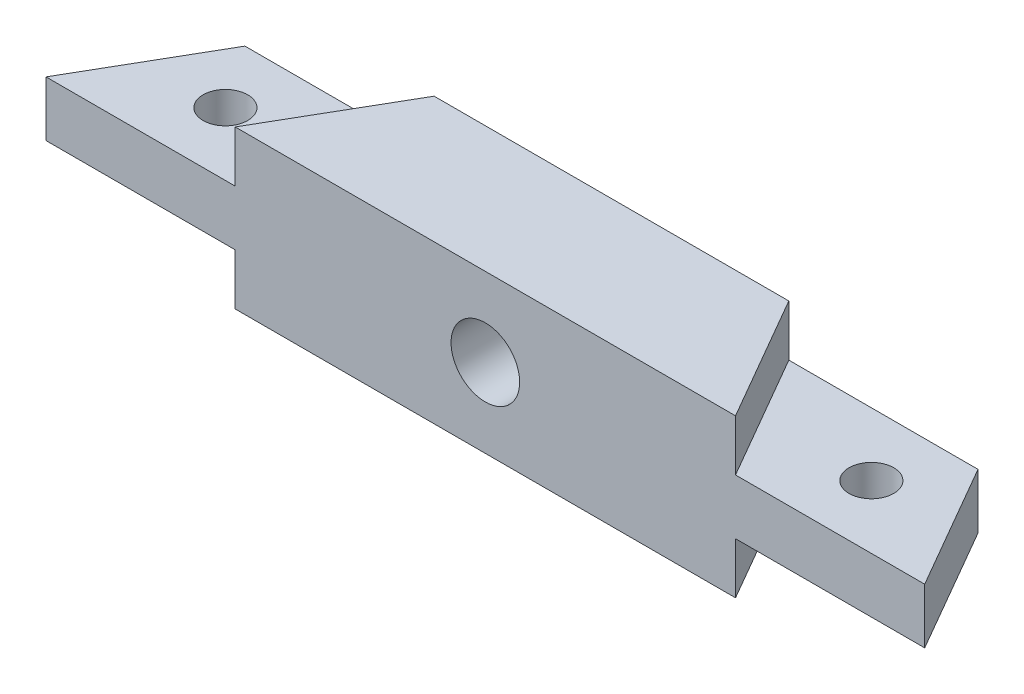
ISO-10303-21;
HEADER;
FILE_DESCRIPTION(('STEP AP214'),'2;1');
FILE_NAME('part.step','',(''),(''),'','','');
FILE_SCHEMA(('AUTOMOTIVE_DESIGN { 1 0 10303 214 1 1 1 1 }'));
ENDSEC;
DATA;
#1=APPLICATION_CONTEXT('core data for automotive mechanical design processes');
#2=APPLICATION_PROTOCOL_DEFINITION('international standard','automotive_design',2000,#1);
#3=PRODUCT_CONTEXT('',#1,'mechanical');
#4=PRODUCT('Part','Part','',(#3));
#5=PRODUCT_RELATED_PRODUCT_CATEGORY('part','',(#4));
#6=PRODUCT_DEFINITION_FORMATION('','',#4);
#7=PRODUCT_DEFINITION_CONTEXT('part definition',#1,'design');
#8=PRODUCT_DEFINITION('design','',#6,#7);
#9=PRODUCT_DEFINITION_SHAPE('','',#8);
#10=(LENGTH_UNIT() NAMED_UNIT(*) SI_UNIT(.MILLI.,.METRE.));
#11=(NAMED_UNIT(*) PLANE_ANGLE_UNIT() SI_UNIT($,.RADIAN.));
#12=(NAMED_UNIT(*) SI_UNIT($,.STERADIAN.) SOLID_ANGLE_UNIT());
#13=UNCERTAINTY_MEASURE_WITH_UNIT(LENGTH_MEASURE(1.E-05),#10,'distance_accuracy_value','');
#14=(GEOMETRIC_REPRESENTATION_CONTEXT(3) GLOBAL_UNCERTAINTY_ASSIGNED_CONTEXT((#13)) GLOBAL_UNIT_ASSIGNED_CONTEXT((#10,
#11,#12)) REPRESENTATION_CONTEXT('',''));
#15=CARTESIAN_POINT('',(0.,0.,0.));
#16=DIRECTION('',(0.,0.,1.));
#17=DIRECTION('',(1.,0.,0.));
#18=AXIS2_PLACEMENT_3D('',#15,#16,#17);
#19=CARTESIAN_POINT('',(17.859375,7.9375,-6.34999999999999));
#20=DIRECTION('',(-0.866025403784436,0.,0.500000000000004));
#21=DIRECTION('',(0.500000000000004,0.,0.866025403784436));
#22=AXIS2_PLACEMENT_3D('',#19,#20,#21);
#23=PLANE('',#22);
#24=DIRECTION('',(-0.500000000000004,0.,-0.866025403784436));
#25=VECTOR('',#24,1.);
#26=CARTESIAN_POINT('',(25.1917234187083,-2.778125,6.34999999999999));
#27=LINE('',#26,#25);
#28=CARTESIAN_POINT('',(25.1917234187083,-2.778125,6.34999999999999));
#29=VERTEX_POINT('',#28);
#30=CARTESIAN_POINT('',(17.859375,-2.778125,-6.34999999999999));
#31=VERTEX_POINT('',#30);
#32=EDGE_CURVE('E163',#29,#31,#27,.T.);
#33=ORIENTED_EDGE('',*,*,#32,.F.);
#34=DIRECTION('',(0.,-1.,0.));
#35=VECTOR('',#34,1.);
#36=CARTESIAN_POINT('',(25.1917234187083,7.9375,6.34999999999999));
#37=LINE('',#36,#35);
#38=CARTESIAN_POINT('',(25.1917234187083,-7.9375,6.34999999999999));
#39=VERTEX_POINT('',#38);
#40=EDGE_CURVE('E146',#29,#39,#37,.T.);
#41=ORIENTED_EDGE('',*,*,#40,.T.);
#42=DIRECTION('',(-0.500000000000004,0.,-0.866025403784436));
#43=VECTOR('',#42,1.);
#44=CARTESIAN_POINT('',(17.859375,-7.9375,-6.34999999999999));
#45=LINE('',#44,#43);
#46=CARTESIAN_POINT('',(17.859375,-7.9375,-6.34999999999999));
#47=VERTEX_POINT('',#46);
#48=EDGE_CURVE('E213',#39,#47,#45,.T.);
#49=ORIENTED_EDGE('',*,*,#48,.T.);
#50=DIRECTION('',(0.,-1.,0.));
#51=VECTOR('',#50,1.);
#52=CARTESIAN_POINT('',(17.859375,7.9375,-6.34999999999999));
#53=LINE('',#52,#51);
#54=EDGE_CURVE('E220',#31,#47,#53,.T.);
#55=ORIENTED_EDGE('',*,*,#54,.F.);
#56=EDGE_LOOP('',(#33,#41,#49,#55));
#57=FACE_BOUND('',#56,.T.);
#58=ADVANCED_FACE('F40',(#57),#23,.F.);
#59=CARTESIAN_POINT('',(-25.1917234187083,7.9375,6.35));
#60=DIRECTION('',(0.866025403784436,0.,0.500000000000004));
#61=DIRECTION('',(0.500000000000004,0.,-0.866025403784436));
#62=AXIS2_PLACEMENT_3D('',#59,#60,#61);
#63=PLANE('',#62);
#64=DIRECTION('',(-0.500000000000004,0.,0.866025403784436));
#65=VECTOR('',#64,1.);
#66=CARTESIAN_POINT('',(-17.859375,-2.778125,-6.34999999999999));
#67=LINE('',#66,#65);
#68=CARTESIAN_POINT('',(-17.859375,-2.778125,-6.34999999999999));
#69=VERTEX_POINT('',#68);
#70=CARTESIAN_POINT('',(-25.1917234187083,-2.778125,6.35));
#71=VERTEX_POINT('',#70);
#72=EDGE_CURVE('E63',#69,#71,#67,.T.);
#73=ORIENTED_EDGE('',*,*,#72,.F.);
#74=DIRECTION('',(0.,-1.,0.));
#75=VECTOR('',#74,1.);
#76=CARTESIAN_POINT('',(-17.859375,7.9375,-6.34999999999999));
#77=LINE('',#76,#75);
#78=CARTESIAN_POINT('',(-17.859375,-7.9375,-6.34999999999999));
#79=VERTEX_POINT('',#78);
#80=EDGE_CURVE('E208',#69,#79,#77,.T.);
#81=ORIENTED_EDGE('',*,*,#80,.T.);
#82=DIRECTION('',(-0.500000000000004,0.,0.866025403784436));
#83=VECTOR('',#82,1.);
#84=CARTESIAN_POINT('',(-25.1917234187083,-7.9375,6.35));
#85=LINE('',#84,#83);
#86=CARTESIAN_POINT('',(-25.1917234187083,-7.9375,6.35));
#87=VERTEX_POINT('',#86);
#88=EDGE_CURVE('E195',#79,#87,#85,.T.);
#89=ORIENTED_EDGE('',*,*,#88,.T.);
#90=DIRECTION('',(0.,-1.,0.));
#91=VECTOR('',#90,1.);
#92=CARTESIAN_POINT('',(-25.1917234187083,7.9375,6.35));
#93=LINE('',#92,#91);
#94=EDGE_CURVE('E48',#71,#87,#93,.T.);
#95=ORIENTED_EDGE('',*,*,#94,.F.);
#96=EDGE_LOOP('',(#73,#81,#89,#95));
#97=FACE_BOUND('',#96,.T.);
#98=ADVANCED_FACE('F277',(#97),#63,.F.);
#99=CARTESIAN_POINT('',(-17.859375,7.9375,-6.34999999999999));
#100=VERTEX_POINT('',#99);
#101=CARTESIAN_POINT('',(-17.859375,2.778125,-6.34999999999999));
#102=VERTEX_POINT('',#101);
#103=EDGE_CURVE('E218',#100,#102,#77,.T.);
#104=ORIENTED_EDGE('',*,*,#103,.T.);
#105=DIRECTION('',(-0.500000000000004,0.,0.866025403784436));
#106=VECTOR('',#105,1.);
#107=CARTESIAN_POINT('',(-17.859375,2.778125,-6.34999999999999));
#108=LINE('',#107,#106);
#109=CARTESIAN_POINT('',(-25.1917234187083,2.778125,6.35));
#110=VERTEX_POINT('',#109);
#111=EDGE_CURVE('E167',#102,#110,#108,.T.);
#112=ORIENTED_EDGE('',*,*,#111,.T.);
#113=CARTESIAN_POINT('',(-25.1917234187083,7.9375,6.35));
#114=VERTEX_POINT('',#113);
#115=EDGE_CURVE('E11',#114,#110,#93,.T.);
#116=ORIENTED_EDGE('',*,*,#115,.F.);
#117=DIRECTION('',(-0.500000000000004,0.,0.866025403784436));
#118=VECTOR('',#117,1.);
#119=CARTESIAN_POINT('',(-25.1917234187083,7.9375,6.35));
#120=LINE('',#119,#118);
#121=EDGE_CURVE('E198',#100,#114,#120,.T.);
#122=ORIENTED_EDGE('',*,*,#121,.F.);
#123=EDGE_LOOP('',(#104,#112,#116,#122));
#124=FACE_BOUND('',#123,.T.);
#125=ADVANCED_FACE('F42',(#124),#63,.F.);
#126=CARTESIAN_POINT('',(25.1917234187083,7.9375,6.34999999999999));
#127=DIRECTION('',(0.,0.,-1.));
#128=DIRECTION('',(-1.,0.,0.));
#129=AXIS2_PLACEMENT_3D('',#126,#127,#128);
#130=PLANE('',#129);
#131=CARTESIAN_POINT('',(0.,0.,6.34999999999999));
#132=DIRECTION('',(0.,0.,1.));
#133=DIRECTION('',(1.,0.,0.));
#134=AXIS2_PLACEMENT_3D('',#131,#132,#133);
#135=CIRCLE('',#134,3.4544);
#136=CARTESIAN_POINT('',(3.4544,0.,6.34999999999999));
#137=VERTEX_POINT('',#136);
#138=EDGE_CURVE('E191',#137,#137,#135,.T.);
#139=ORIENTED_EDGE('',*,*,#138,.F.);
#140=EDGE_LOOP('',(#139));
#141=FACE_BOUND('',#140,.T.);
#142=DIRECTION('',(1.,0.,0.));
#143=VECTOR('',#142,1.);
#144=CARTESIAN_POINT('',(25.1917234187083,-7.9375,6.34999999999999));
#145=LINE('',#144,#143);
#146=EDGE_CURVE('E211',#87,#39,#145,.T.);
#147=ORIENTED_EDGE('',*,*,#146,.T.);
#148=ORIENTED_EDGE('',*,*,#40,.F.);
#149=DIRECTION('',(1.,0.,0.));
#150=VECTOR('',#149,1.);
#151=CARTESIAN_POINT('',(25.1917234187083,-2.778125,6.34999999999999));
#152=LINE('',#151,#150);
#153=CARTESIAN_POINT('',(44.2417234187083,-2.778125,6.34999999999999));
#154=VERTEX_POINT('',#153);
#155=EDGE_CURVE('E143',#29,#154,#152,.T.);
#156=ORIENTED_EDGE('',*,*,#155,.T.);
#157=DIRECTION('',(0.,1.,0.));
#158=VECTOR('',#157,1.);
#159=CARTESIAN_POINT('',(44.2417234187083,-2.778125,6.34999999999999));
#160=LINE('',#159,#158);
#161=CARTESIAN_POINT('',(44.2417234187083,2.778125,6.34999999999999));
#162=VERTEX_POINT('',#161);
#163=EDGE_CURVE('E132',#154,#162,#160,.T.);
#164=ORIENTED_EDGE('',*,*,#163,.T.);
#165=DIRECTION('',(-1.,0.,0.));
#166=VECTOR('',#165,1.);
#167=CARTESIAN_POINT('',(25.1917234187083,2.778125,6.34999999999999));
#168=LINE('',#167,#166);
#169=CARTESIAN_POINT('',(25.1917234187083,2.778125,6.34999999999999));
#170=VERTEX_POINT('',#169);
#171=EDGE_CURVE('E139',#162,#170,#168,.T.);
#172=ORIENTED_EDGE('',*,*,#171,.T.);
#173=CARTESIAN_POINT('',(25.1917234187083,7.9375,6.34999999999999));
#174=VERTEX_POINT('',#173);
#175=EDGE_CURVE('E223',#174,#170,#37,.T.);
#176=ORIENTED_EDGE('',*,*,#175,.F.);
#177=DIRECTION('',(1.,0.,0.));
#178=VECTOR('',#177,1.);
#179=CARTESIAN_POINT('',(25.1917234187083,7.9375,6.34999999999999));
#180=LINE('',#179,#178);
#181=EDGE_CURVE('E201',#114,#174,#180,.T.);
#182=ORIENTED_EDGE('',*,*,#181,.F.);
#183=ORIENTED_EDGE('',*,*,#115,.T.);
#184=DIRECTION('',(-1.,0.,0.));
#185=VECTOR('',#184,1.);
#186=CARTESIAN_POINT('',(-25.1917234187083,2.778125,6.34999999999999));
#187=LINE('',#186,#185);
#188=CARTESIAN_POINT('',(-44.2417234187083,2.778125,6.35));
#189=VERTEX_POINT('',#188);
#190=EDGE_CURVE('E169',#110,#189,#187,.T.);
#191=ORIENTED_EDGE('',*,*,#190,.T.);
#192=DIRECTION('',(0.,-1.,0.));
#193=VECTOR('',#192,1.);
#194=CARTESIAN_POINT('',(-44.2417234187083,-2.778125,6.34999999999999));
#195=LINE('',#194,#193);
#196=CARTESIAN_POINT('',(-44.2417234187083,-2.778125,6.35));
#197=VERTEX_POINT('',#196);
#198=EDGE_CURVE('E179',#189,#197,#195,.T.);
#199=ORIENTED_EDGE('',*,*,#198,.T.);
#200=DIRECTION('',(1.,0.,0.));
#201=VECTOR('',#200,1.);
#202=CARTESIAN_POINT('',(-25.1917234187083,-2.778125,6.34999999999999));
#203=LINE('',#202,#201);
#204=EDGE_CURVE('E186',#197,#71,#203,.T.);
#205=ORIENTED_EDGE('',*,*,#204,.T.);
#206=ORIENTED_EDGE('',*,*,#94,.T.);
#207=EDGE_LOOP('',(#147,#148,#156,#164,#172,#176,#182,#183,#191,#199,#205,#206));
#208=FACE_BOUND('',#207,.T.);
#209=ADVANCED_FACE('F145',(#141,#208),#130,.F.);
#210=ORIENTED_EDGE('',*,*,#175,.T.);
#211=DIRECTION('',(-0.500000000000004,0.,-0.866025403784436));
#212=VECTOR('',#211,1.);
#213=CARTESIAN_POINT('',(25.1917234187083,2.778125,6.34999999999999));
#214=LINE('',#213,#212);
#215=CARTESIAN_POINT('',(17.859375,2.778125,-6.34999999999999));
#216=VERTEX_POINT('',#215);
#217=EDGE_CURVE('E161',#170,#216,#214,.T.);
#218=ORIENTED_EDGE('',*,*,#217,.T.);
#219=CARTESIAN_POINT('',(17.859375,7.9375,-6.34999999999999));
#220=VERTEX_POINT('',#219);
#221=EDGE_CURVE('E221',#220,#216,#53,.T.);
#222=ORIENTED_EDGE('',*,*,#221,.F.);
#223=DIRECTION('',(-0.500000000000004,0.,-0.866025403784436));
#224=VECTOR('',#223,1.);
#225=CARTESIAN_POINT('',(17.859375,7.9375,-6.34999999999999));
#226=LINE('',#225,#224);
#227=EDGE_CURVE('E204',#174,#220,#226,.T.);
#228=ORIENTED_EDGE('',*,*,#227,.F.);
#229=EDGE_LOOP('',(#210,#218,#222,#228));
#230=FACE_BOUND('',#229,.T.);
#231=ADVANCED_FACE('F241',(#230),#23,.F.);
#232=CARTESIAN_POINT('',(-17.859375,7.9375,-6.34999999999999));
#233=DIRECTION('',(0.,0.,1.));
#234=DIRECTION('',(1.,0.,0.));
#235=AXIS2_PLACEMENT_3D('',#232,#233,#234);
#236=PLANE('',#235);
#237=CARTESIAN_POINT('',(0.,0.,-6.34999999999999));
#238=DIRECTION('',(0.,0.,1.));
#239=DIRECTION('',(1.,0.,0.));
#240=AXIS2_PLACEMENT_3D('',#237,#238,#239);
#241=CIRCLE('',#240,3.4544);
#242=CARTESIAN_POINT('',(3.4544,0.,-6.34999999999999));
#243=VERTEX_POINT('',#242);
#244=EDGE_CURVE('E192',#243,#243,#241,.T.);
#245=ORIENTED_EDGE('',*,*,#244,.T.);
#246=EDGE_LOOP('',(#245));
#247=FACE_BOUND('',#246,.T.);
#248=DIRECTION('',(-1.,0.,0.));
#249=VECTOR('',#248,1.);
#250=CARTESIAN_POINT('',(-17.859375,-7.9375,-6.34999999999999));
#251=LINE('',#250,#249);
#252=EDGE_CURVE('E202',#47,#79,#251,.T.);
#253=ORIENTED_EDGE('',*,*,#252,.T.);
#254=ORIENTED_EDGE('',*,*,#80,.F.);
#255=DIRECTION('',(1.,0.,0.));
#256=VECTOR('',#255,1.);
#257=CARTESIAN_POINT('',(-17.859375,-2.778125,-6.34999999999999));
#258=LINE('',#257,#256);
#259=CARTESIAN_POINT('',(-36.909375,-2.778125,-6.34999999999999));
#260=VERTEX_POINT('',#259);
#261=EDGE_CURVE('E171',#260,#69,#258,.T.);
#262=ORIENTED_EDGE('',*,*,#261,.F.);
#263=DIRECTION('',(0.,-1.,0.));
#264=VECTOR('',#263,1.);
#265=CARTESIAN_POINT('',(-36.909375,-2.778125,-6.34999999999999));
#266=LINE('',#265,#264);
#267=CARTESIAN_POINT('',(-36.909375,2.778125,-6.34999999999999));
#268=VERTEX_POINT('',#267);
#269=EDGE_CURVE('E174',#268,#260,#266,.T.);
#270=ORIENTED_EDGE('',*,*,#269,.F.);
#271=DIRECTION('',(-1.,0.,0.));
#272=VECTOR('',#271,1.);
#273=CARTESIAN_POINT('',(-17.859375,2.778125,-6.34999999999999));
#274=LINE('',#273,#272);
#275=EDGE_CURVE('E166',#102,#268,#274,.T.);
#276=ORIENTED_EDGE('',*,*,#275,.F.);
#277=ORIENTED_EDGE('',*,*,#103,.F.);
#278=DIRECTION('',(-1.,0.,0.));
#279=VECTOR('',#278,1.);
#280=CARTESIAN_POINT('',(-17.859375,7.9375,-6.34999999999999));
#281=LINE('',#280,#279);
#282=EDGE_CURVE('E206',#220,#100,#281,.T.);
#283=ORIENTED_EDGE('',*,*,#282,.F.);
#284=ORIENTED_EDGE('',*,*,#221,.T.);
#285=DIRECTION('',(-1.,0.,0.));
#286=VECTOR('',#285,1.);
#287=CARTESIAN_POINT('',(17.859375,2.778125,-6.34999999999999));
#288=LINE('',#287,#286);
#289=CARTESIAN_POINT('',(36.909375,2.778125,-6.34999999999999));
#290=VERTEX_POINT('',#289);
#291=EDGE_CURVE('E55',#290,#216,#288,.T.);
#292=ORIENTED_EDGE('',*,*,#291,.F.);
#293=DIRECTION('',(0.,1.,0.));
#294=VECTOR('',#293,1.);
#295=CARTESIAN_POINT('',(36.909375,-2.778125,-6.34999999999999));
#296=LINE('',#295,#294);
#297=CARTESIAN_POINT('',(36.909375,-2.778125,-6.34999999999999));
#298=VERTEX_POINT('',#297);
#299=EDGE_CURVE('E154',#298,#290,#296,.T.);
#300=ORIENTED_EDGE('',*,*,#299,.F.);
#301=DIRECTION('',(1.,0.,0.));
#302=VECTOR('',#301,1.);
#303=CARTESIAN_POINT('',(17.859375,-2.778125,-6.34999999999999));
#304=LINE('',#303,#302);
#305=EDGE_CURVE('E152',#31,#298,#304,.T.);
#306=ORIENTED_EDGE('',*,*,#305,.F.);
#307=ORIENTED_EDGE('',*,*,#54,.T.);
#308=EDGE_LOOP('',(#253,#254,#262,#270,#276,#277,#283,#284,#292,#300,#306,#307));
#309=FACE_BOUND('',#308,.T.);
#310=ADVANCED_FACE('F237',(#247,#309),#236,.F.);
#311=CARTESIAN_POINT('',(0.,7.9375,0.));
#312=DIRECTION('',(0.,-1.,0.));
#313=DIRECTION('',(0.,0.,-1.));
#314=AXIS2_PLACEMENT_3D('',#311,#312,#313);
#315=PLANE('',#314);
#316=ORIENTED_EDGE('',*,*,#121,.T.);
#317=ORIENTED_EDGE('',*,*,#181,.T.);
#318=ORIENTED_EDGE('',*,*,#227,.T.);
#319=ORIENTED_EDGE('',*,*,#282,.T.);
#320=EDGE_LOOP('',(#316,#317,#318,#319));
#321=FACE_BOUND('',#320,.T.);
#322=ADVANCED_FACE('F243',(#321),#315,.F.);
#323=CARTESIAN_POINT('',(0.,-7.9375,0.));
#324=DIRECTION('',(0.,-1.,0.));
#325=DIRECTION('',(0.,0.,-1.));
#326=AXIS2_PLACEMENT_3D('',#323,#324,#325);
#327=PLANE('',#326);
#328=ORIENTED_EDGE('',*,*,#88,.F.);
#329=ORIENTED_EDGE('',*,*,#252,.F.);
#330=ORIENTED_EDGE('',*,*,#48,.F.);
#331=ORIENTED_EDGE('',*,*,#146,.F.);
#332=EDGE_LOOP('',(#328,#329,#330,#331));
#333=FACE_BOUND('',#332,.T.);
#334=ADVANCED_FACE('F235',(#333),#327,.T.);
#335=CARTESIAN_POINT('',(0.,0.,-6.34999999999999));
#336=DIRECTION('',(0.,0.,1.));
#337=DIRECTION('',(1.,0.,0.));
#338=AXIS2_PLACEMENT_3D('',#335,#336,#337);
#339=CYLINDRICAL_SURFACE('',#338,3.4544);
#340=ORIENTED_EDGE('',*,*,#244,.F.);
#341=EDGE_LOOP('',(#340));
#342=FACE_BOUND('',#341,.T.);
#343=ORIENTED_EDGE('',*,*,#138,.T.);
#344=EDGE_LOOP('',(#343));
#345=FACE_BOUND('',#344,.T.);
#346=ADVANCED_FACE('F264',(#342,#345),#339,.F.);
#347=CARTESIAN_POINT('',(-17.859375,2.778125,-6.34999999999999));
#348=DIRECTION('',(0.,1.,0.));
#349=DIRECTION('',(-1.,0.,0.));
#350=AXIS2_PLACEMENT_3D('',#347,#348,#349);
#351=PLANE('',#350);
#352=CARTESIAN_POINT('',(-32.5240718374165,2.778125,0.));
#353=DIRECTION('',(0.,1.,0.));
#354=DIRECTION('',(-1.,0.,0.));
#355=AXIS2_PLACEMENT_3D('',#352,#353,#354);
#356=CIRCLE('',#355,2.2479);
#357=CARTESIAN_POINT('',(-34.7719718374165,2.778125,0.));
#358=VERTEX_POINT('',#357);
#359=EDGE_CURVE('E140',#358,#358,#356,.T.);
#360=ORIENTED_EDGE('',*,*,#359,.F.);
#361=EDGE_LOOP('',(#360));
#362=FACE_BOUND('',#361,.T.);
#363=DIRECTION('',(-0.500000000000004,0.,0.866025403784436));
#364=VECTOR('',#363,1.);
#365=CARTESIAN_POINT('',(-36.909375,2.778125,-6.34999999999999));
#366=LINE('',#365,#364);
#367=EDGE_CURVE('E176',#268,#189,#366,.T.);
#368=ORIENTED_EDGE('',*,*,#367,.T.);
#369=ORIENTED_EDGE('',*,*,#190,.F.);
#370=ORIENTED_EDGE('',*,*,#111,.F.);
#371=ORIENTED_EDGE('',*,*,#275,.T.);
#372=EDGE_LOOP('',(#368,#369,#370,#371));
#373=FACE_BOUND('',#372,.T.);
#374=ADVANCED_FACE('F252',(#362,#373),#351,.T.);
#375=CARTESIAN_POINT('',(-36.909375,-2.778125,-6.34999999999999));
#376=DIRECTION('',(-0.866025403784436,0.,-0.500000000000004));
#377=DIRECTION('',(-0.500000000000004,0.,0.866025403784436));
#378=AXIS2_PLACEMENT_3D('',#375,#376,#377);
#379=PLANE('',#378);
#380=DIRECTION('',(-0.500000000000004,0.,0.866025403784436));
#381=VECTOR('',#380,1.);
#382=CARTESIAN_POINT('',(-36.909375,-2.778125,-6.34999999999999));
#383=LINE('',#382,#381);
#384=EDGE_CURVE('E183',#260,#197,#383,.T.);
#385=ORIENTED_EDGE('',*,*,#384,.T.);
#386=ORIENTED_EDGE('',*,*,#198,.F.);
#387=ORIENTED_EDGE('',*,*,#367,.F.);
#388=ORIENTED_EDGE('',*,*,#269,.T.);
#389=EDGE_LOOP('',(#385,#386,#387,#388));
#390=FACE_BOUND('',#389,.T.);
#391=ADVANCED_FACE('F256',(#390),#379,.T.);
#392=CARTESIAN_POINT('',(-17.859375,-2.778125,-6.34999999999999));
#393=DIRECTION('',(0.,-1.,0.));
#394=DIRECTION('',(1.,0.,0.));
#395=AXIS2_PLACEMENT_3D('',#392,#393,#394);
#396=PLANE('',#395);
#397=CARTESIAN_POINT('',(-32.5240718374165,-2.778125,0.));
#398=DIRECTION('',(0.,-1.,0.));
#399=DIRECTION('',(1.,0.,0.));
#400=AXIS2_PLACEMENT_3D('',#397,#398,#399);
#401=CIRCLE('',#400,2.2479);
#402=CARTESIAN_POINT('',(-30.2761718374165,-2.778125,0.));
#403=VERTEX_POINT('',#402);
#404=EDGE_CURVE('E440',#403,#403,#401,.F.);
#405=ORIENTED_EDGE('',*,*,#404,.T.);
#406=EDGE_LOOP('',(#405));
#407=FACE_BOUND('',#406,.T.);
#408=ORIENTED_EDGE('',*,*,#204,.F.);
#409=ORIENTED_EDGE('',*,*,#384,.F.);
#410=ORIENTED_EDGE('',*,*,#261,.T.);
#411=ORIENTED_EDGE('',*,*,#72,.T.);
#412=EDGE_LOOP('',(#408,#409,#410,#411));
#413=FACE_BOUND('',#412,.T.);
#414=ADVANCED_FACE('F260',(#407,#413),#396,.T.);
#415=CARTESIAN_POINT('',(44.2417234187083,-2.778125,6.34999999999999));
#416=DIRECTION('',(-0.866025403784436,0.,0.500000000000004));
#417=DIRECTION('',(0.500000000000004,0.,0.866025403784436));
#418=AXIS2_PLACEMENT_3D('',#415,#416,#417);
#419=PLANE('',#418);
#420=DIRECTION('',(-0.500000000000004,0.,-0.866025403784436));
#421=VECTOR('',#420,1.);
#422=CARTESIAN_POINT('',(44.2417234187083,2.778125,6.34999999999999));
#423=LINE('',#422,#421);
#424=EDGE_CURVE('E137',#162,#290,#423,.T.);
#425=ORIENTED_EDGE('',*,*,#424,.F.);
#426=ORIENTED_EDGE('',*,*,#163,.F.);
#427=DIRECTION('',(-0.500000000000004,0.,-0.866025403784436));
#428=VECTOR('',#427,1.);
#429=CARTESIAN_POINT('',(44.2417234187083,-2.778125,6.34999999999999));
#430=LINE('',#429,#428);
#431=EDGE_CURVE('E136',#154,#298,#430,.T.);
#432=ORIENTED_EDGE('',*,*,#431,.T.);
#433=ORIENTED_EDGE('',*,*,#299,.T.);
#434=EDGE_LOOP('',(#425,#426,#432,#433));
#435=FACE_BOUND('',#434,.T.);
#436=ADVANCED_FACE('F134',(#435),#419,.F.);
#437=CARTESIAN_POINT('',(25.1917234187083,2.778125,6.34999999999999));
#438=DIRECTION('',(0.,-1.,0.));
#439=DIRECTION('',(1.,0.,0.));
#440=AXIS2_PLACEMENT_3D('',#437,#438,#439);
#441=PLANE('',#440);
#442=CARTESIAN_POINT('',(32.5240718374165,2.778125,0.));
#443=DIRECTION('',(0.,1.,0.));
#444=DIRECTION('',(1.,0.,0.));
#445=AXIS2_PLACEMENT_3D('',#442,#443,#444);
#446=CIRCLE('',#445,2.2479);
#447=CARTESIAN_POINT('',(34.7719718374165,2.778125,0.));
#448=VERTEX_POINT('',#447);
#449=EDGE_CURVE('E447',#448,#448,#446,.T.);
#450=ORIENTED_EDGE('',*,*,#449,.F.);
#451=EDGE_LOOP('',(#450));
#452=FACE_BOUND('',#451,.T.);
#453=ORIENTED_EDGE('',*,*,#217,.F.);
#454=ORIENTED_EDGE('',*,*,#171,.F.);
#455=ORIENTED_EDGE('',*,*,#424,.T.);
#456=ORIENTED_EDGE('',*,*,#291,.T.);
#457=EDGE_LOOP('',(#453,#454,#455,#456));
#458=FACE_BOUND('',#457,.T.);
#459=ADVANCED_FACE('F240',(#452,#458),#441,.F.);
#460=CARTESIAN_POINT('',(25.1917234187083,-2.778125,6.34999999999999));
#461=DIRECTION('',(0.,1.,0.));
#462=DIRECTION('',(-1.,0.,0.));
#463=AXIS2_PLACEMENT_3D('',#460,#461,#462);
#464=PLANE('',#463);
#465=CARTESIAN_POINT('',(32.5240718374165,-2.778125,0.));
#466=DIRECTION('',(0.,1.,0.));
#467=DIRECTION('',(-1.,0.,0.));
#468=AXIS2_PLACEMENT_3D('',#465,#466,#467);
#469=CIRCLE('',#468,2.2479);
#470=CARTESIAN_POINT('',(30.2761718374165,-2.778125,0.));
#471=VERTEX_POINT('',#470);
#472=EDGE_CURVE('E444',#471,#471,#469,.F.);
#473=ORIENTED_EDGE('',*,*,#472,.F.);
#474=EDGE_LOOP('',(#473));
#475=FACE_BOUND('',#474,.T.);
#476=ORIENTED_EDGE('',*,*,#305,.T.);
#477=ORIENTED_EDGE('',*,*,#431,.F.);
#478=ORIENTED_EDGE('',*,*,#155,.F.);
#479=ORIENTED_EDGE('',*,*,#32,.T.);
#480=EDGE_LOOP('',(#476,#477,#478,#479));
#481=FACE_BOUND('',#480,.T.);
#482=ADVANCED_FACE('F151',(#475,#481),#464,.F.);
#483=CARTESIAN_POINT('',(32.5240718374165,-7.9385,0.));
#484=DIRECTION('',(0.,1.,0.));
#485=DIRECTION('',(-1.,0.,0.));
#486=AXIS2_PLACEMENT_3D('',#483,#484,#485);
#487=CYLINDRICAL_SURFACE('',#486,2.2479);
#488=ORIENTED_EDGE('',*,*,#449,.T.);
#489=EDGE_LOOP('',(#488));
#490=FACE_BOUND('',#489,.T.);
#491=ORIENTED_EDGE('',*,*,#472,.T.);
#492=EDGE_LOOP('',(#491));
#493=FACE_BOUND('',#492,.T.);
#494=ADVANCED_FACE('F270',(#490,#493),#487,.F.);
#495=CARTESIAN_POINT('',(-32.5240718374165,-7.9385,0.));
#496=DIRECTION('',(0.,1.,0.));
#497=DIRECTION('',(-1.,0.,0.));
#498=AXIS2_PLACEMENT_3D('',#495,#496,#497);
#499=CYLINDRICAL_SURFACE('',#498,2.2479);
#500=ORIENTED_EDGE('',*,*,#404,.F.);
#501=EDGE_LOOP('',(#500));
#502=FACE_BOUND('',#501,.T.);
#503=ORIENTED_EDGE('',*,*,#359,.T.);
#504=EDGE_LOOP('',(#503));
#505=FACE_BOUND('',#504,.T.);
#506=ADVANCED_FACE('F365',(#502,#505),#499,.F.);
#507=CLOSED_SHELL('',(#58,#98,#125,#209,#231,#310,#322,#334,#346,#374,#391,#414,#436,#459,#482,
#494,#506));
#508=MANIFOLD_SOLID_BREP('B2',#507);
#509=ADVANCED_BREP_SHAPE_REPRESENTATION('',(#18,#508),#14);
#510=SHAPE_DEFINITION_REPRESENTATION(#9,#509);
ENDSEC;
END-ISO-10303-21;
